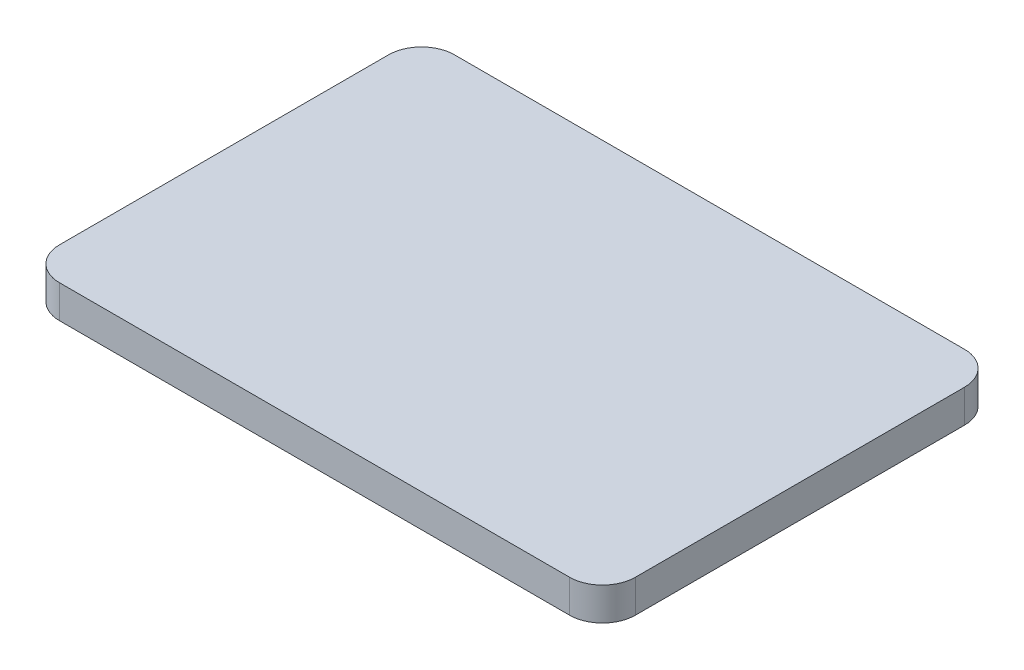
ISO-10303-21;
HEADER;
FILE_DESCRIPTION(('STEP AP214'),'2;1');
FILE_NAME('part.step','',(''),(''),'','','');
FILE_SCHEMA(('AUTOMOTIVE_DESIGN { 1 0 10303 214 1 1 1 1 }'));
ENDSEC;
DATA;
#1=APPLICATION_CONTEXT('core data for automotive mechanical design processes');
#2=APPLICATION_PROTOCOL_DEFINITION('international standard','automotive_design',2000,#1);
#3=PRODUCT_CONTEXT('',#1,'mechanical');
#4=PRODUCT('Part','Part','',(#3));
#5=PRODUCT_RELATED_PRODUCT_CATEGORY('part','',(#4));
#6=PRODUCT_DEFINITION_FORMATION('','',#4);
#7=PRODUCT_DEFINITION_CONTEXT('part definition',#1,'design');
#8=PRODUCT_DEFINITION('design','',#6,#7);
#9=PRODUCT_DEFINITION_SHAPE('','',#8);
#10=(LENGTH_UNIT() NAMED_UNIT(*) SI_UNIT(.MILLI.,.METRE.));
#11=(NAMED_UNIT(*) PLANE_ANGLE_UNIT() SI_UNIT($,.RADIAN.));
#12=(NAMED_UNIT(*) SI_UNIT($,.STERADIAN.) SOLID_ANGLE_UNIT());
#13=UNCERTAINTY_MEASURE_WITH_UNIT(LENGTH_MEASURE(1.E-05),#10,'distance_accuracy_value','');
#14=(GEOMETRIC_REPRESENTATION_CONTEXT(3) GLOBAL_UNCERTAINTY_ASSIGNED_CONTEXT((#13)) GLOBAL_UNIT_ASSIGNED_CONTEXT((#10,
#11,#12)) REPRESENTATION_CONTEXT('',''));
#15=CARTESIAN_POINT('',(0.,0.,0.));
#16=DIRECTION('',(0.,0.,1.));
#17=DIRECTION('',(1.,0.,0.));
#18=AXIS2_PLACEMENT_3D('',#15,#16,#17);
#19=CARTESIAN_POINT('',(0.999999999999997,1.,-11.));
#20=DIRECTION('',(0.,-1.,0.));
#21=DIRECTION('',(0.,0.,-1.));
#22=AXIS2_PLACEMENT_3D('',#19,#20,#21);
#23=CYLINDRICAL_SURFACE('',#22,1.);
#24=CARTESIAN_POINT('',(0.999999999999997,0.,-11.));
#25=DIRECTION('',(0.,1.,0.));
#26=DIRECTION('',(0.,0.,-1.));
#27=AXIS2_PLACEMENT_3D('',#24,#25,#26);
#28=CIRCLE('',#27,1.);
#29=CARTESIAN_POINT('',(1.,0.,-12.));
#30=VERTEX_POINT('',#29);
#31=CARTESIAN_POINT('',(0.,0.,-11.));
#32=VERTEX_POINT('',#31);
#33=EDGE_CURVE('E145',#30,#32,#28,.T.);
#34=ORIENTED_EDGE('',*,*,#33,.T.);
#35=DIRECTION('',(0.,-1.,0.));
#36=VECTOR('',#35,1.);
#37=CARTESIAN_POINT('',(0.,1.,-11.));
#38=LINE('',#37,#36);
#39=CARTESIAN_POINT('',(0.,1.,-11.));
#40=VERTEX_POINT('',#39);
#41=EDGE_CURVE('E11',#40,#32,#38,.T.);
#42=ORIENTED_EDGE('',*,*,#41,.F.);
#43=CARTESIAN_POINT('',(0.999999999999997,1.,-11.));
#44=DIRECTION('',(0.,1.,0.));
#45=DIRECTION('',(0.,0.,-1.));
#46=AXIS2_PLACEMENT_3D('',#43,#44,#45);
#47=CIRCLE('',#46,1.);
#48=CARTESIAN_POINT('',(1.,1.,-12.));
#49=VERTEX_POINT('',#48);
#50=EDGE_CURVE('E167',#49,#40,#47,.T.);
#51=ORIENTED_EDGE('',*,*,#50,.F.);
#52=DIRECTION('',(0.,-1.,0.));
#53=VECTOR('',#52,1.);
#54=CARTESIAN_POINT('',(1.,1.,-12.));
#55=LINE('',#54,#53);
#56=EDGE_CURVE('E141',#49,#30,#55,.T.);
#57=ORIENTED_EDGE('',*,*,#56,.T.);
#58=EDGE_LOOP('',(#34,#42,#51,#57));
#59=FACE_BOUND('',#58,.T.);
#60=ADVANCED_FACE('F44',(#59),#23,.T.);
#61=CARTESIAN_POINT('',(0.,1.,-1.00000000000001));
#62=DIRECTION('',(1.,0.,0.));
#63=DIRECTION('',(0.,0.,-1.));
#64=AXIS2_PLACEMENT_3D('',#61,#62,#63);
#65=PLANE('',#64);
#66=DIRECTION('',(0.,0.,1.));
#67=VECTOR('',#66,1.);
#68=CARTESIAN_POINT('',(0.,0.,-1.00000000000001));
#69=LINE('',#68,#67);
#70=CARTESIAN_POINT('',(0.,0.,-1.00000000000001));
#71=VERTEX_POINT('',#70);
#72=EDGE_CURVE('E149',#32,#71,#69,.T.);
#73=ORIENTED_EDGE('',*,*,#72,.T.);
#74=DIRECTION('',(0.,-1.,0.));
#75=VECTOR('',#74,1.);
#76=CARTESIAN_POINT('',(0.,1.,-1.00000000000001));
#77=LINE('',#76,#75);
#78=CARTESIAN_POINT('',(0.,1.,-1.00000000000001));
#79=VERTEX_POINT('',#78);
#80=EDGE_CURVE('E53',#79,#71,#77,.T.);
#81=ORIENTED_EDGE('',*,*,#80,.F.);
#82=DIRECTION('',(0.,0.,1.));
#83=VECTOR('',#82,1.);
#84=CARTESIAN_POINT('',(0.,1.,-1.00000000000001));
#85=LINE('',#84,#83);
#86=EDGE_CURVE('E104',#40,#79,#85,.T.);
#87=ORIENTED_EDGE('',*,*,#86,.F.);
#88=ORIENTED_EDGE('',*,*,#41,.T.);
#89=EDGE_LOOP('',(#73,#81,#87,#88));
#90=FACE_BOUND('',#89,.T.);
#91=ADVANCED_FACE('F213',(#90),#65,.F.);
#92=CARTESIAN_POINT('',(1.,1.,-1.));
#93=DIRECTION('',(0.,-1.,0.));
#94=DIRECTION('',(0.,0.,-1.));
#95=AXIS2_PLACEMENT_3D('',#92,#93,#94);
#96=CYLINDRICAL_SURFACE('',#95,1.);
#97=CARTESIAN_POINT('',(1.,0.,-1.));
#98=DIRECTION('',(0.,1.,0.));
#99=DIRECTION('',(0.,0.,1.));
#100=AXIS2_PLACEMENT_3D('',#97,#98,#99);
#101=CIRCLE('',#100,1.);
#102=CARTESIAN_POINT('',(1.,0.,0.));
#103=VERTEX_POINT('',#102);
#104=EDGE_CURVE('E152',#71,#103,#101,.T.);
#105=ORIENTED_EDGE('',*,*,#104,.T.);
#106=DIRECTION('',(0.,-1.,0.));
#107=VECTOR('',#106,1.);
#108=CARTESIAN_POINT('',(1.,1.,0.));
#109=LINE('',#108,#107);
#110=CARTESIAN_POINT('',(1.,1.,0.));
#111=VERTEX_POINT('',#110);
#112=EDGE_CURVE('E178',#111,#103,#109,.T.);
#113=ORIENTED_EDGE('',*,*,#112,.F.);
#114=CARTESIAN_POINT('',(1.,1.,-1.));
#115=DIRECTION('',(0.,1.,0.));
#116=DIRECTION('',(0.,0.,1.));
#117=AXIS2_PLACEMENT_3D('',#114,#115,#116);
#118=CIRCLE('',#117,1.);
#119=EDGE_CURVE('E188',#79,#111,#118,.T.);
#120=ORIENTED_EDGE('',*,*,#119,.F.);
#121=ORIENTED_EDGE('',*,*,#80,.T.);
#122=EDGE_LOOP('',(#105,#113,#120,#121));
#123=FACE_BOUND('',#122,.T.);
#124=ADVANCED_FACE('F186',(#123),#96,.T.);
#125=CARTESIAN_POINT('',(16.5,1.,0.));
#126=DIRECTION('',(0.,0.,-1.));
#127=DIRECTION('',(-1.,0.,0.));
#128=AXIS2_PLACEMENT_3D('',#125,#126,#127);
#129=PLANE('',#128);
#130=DIRECTION('',(1.,0.,0.));
#131=VECTOR('',#130,1.);
#132=CARTESIAN_POINT('',(16.5,0.,0.));
#133=LINE('',#132,#131);
#134=CARTESIAN_POINT('',(16.5,0.,0.));
#135=VERTEX_POINT('',#134);
#136=EDGE_CURVE('E155',#103,#135,#133,.T.);
#137=ORIENTED_EDGE('',*,*,#136,.T.);
#138=DIRECTION('',(0.,-1.,0.));
#139=VECTOR('',#138,1.);
#140=CARTESIAN_POINT('',(16.5,1.,0.));
#141=LINE('',#140,#139);
#142=CARTESIAN_POINT('',(16.5,1.,0.));
#143=VERTEX_POINT('',#142);
#144=EDGE_CURVE('E174',#143,#135,#141,.T.);
#145=ORIENTED_EDGE('',*,*,#144,.F.);
#146=DIRECTION('',(1.,0.,0.));
#147=VECTOR('',#146,1.);
#148=CARTESIAN_POINT('',(16.5,1.,0.));
#149=LINE('',#148,#147);
#150=EDGE_CURVE('E201',#111,#143,#149,.T.);
#151=ORIENTED_EDGE('',*,*,#150,.F.);
#152=ORIENTED_EDGE('',*,*,#112,.T.);
#153=EDGE_LOOP('',(#137,#145,#151,#152));
#154=FACE_BOUND('',#153,.T.);
#155=ADVANCED_FACE('F196',(#154),#129,.F.);
#156=CARTESIAN_POINT('',(16.5,1.,-1.));
#157=DIRECTION('',(0.,-1.,0.));
#158=DIRECTION('',(0.,0.,-1.));
#159=AXIS2_PLACEMENT_3D('',#156,#157,#158);
#160=CYLINDRICAL_SURFACE('',#159,1.);
#161=CARTESIAN_POINT('',(16.5,0.,-1.));
#162=DIRECTION('',(0.,1.,0.));
#163=DIRECTION('',(0.,0.,-1.));
#164=AXIS2_PLACEMENT_3D('',#161,#162,#163);
#165=CIRCLE('',#164,1.);
#166=CARTESIAN_POINT('',(17.5,0.,-1.00000000000001));
#167=VERTEX_POINT('',#166);
#168=EDGE_CURVE('E158',#135,#167,#165,.T.);
#169=ORIENTED_EDGE('',*,*,#168,.T.);
#170=DIRECTION('',(0.,-1.,0.));
#171=VECTOR('',#170,1.);
#172=CARTESIAN_POINT('',(17.5,1.,-1.00000000000001));
#173=LINE('',#172,#171);
#174=CARTESIAN_POINT('',(17.5,1.,-1.00000000000001));
#175=VERTEX_POINT('',#174);
#176=EDGE_CURVE('E134',#175,#167,#173,.T.);
#177=ORIENTED_EDGE('',*,*,#176,.F.);
#178=CARTESIAN_POINT('',(16.5,1.,-1.));
#179=DIRECTION('',(0.,1.,0.));
#180=DIRECTION('',(0.,0.,-1.));
#181=AXIS2_PLACEMENT_3D('',#178,#179,#180);
#182=CIRCLE('',#181,1.);
#183=EDGE_CURVE('E123',#143,#175,#182,.T.);
#184=ORIENTED_EDGE('',*,*,#183,.F.);
#185=ORIENTED_EDGE('',*,*,#144,.T.);
#186=EDGE_LOOP('',(#169,#177,#184,#185));
#187=FACE_BOUND('',#186,.T.);
#188=ADVANCED_FACE('F199',(#187),#160,.T.);
#189=CARTESIAN_POINT('',(17.5,1.,-11.));
#190=DIRECTION('',(-1.,0.,0.));
#191=DIRECTION('',(0.,0.,1.));
#192=AXIS2_PLACEMENT_3D('',#189,#190,#191);
#193=PLANE('',#192);
#194=DIRECTION('',(0.,0.,-1.));
#195=VECTOR('',#194,1.);
#196=CARTESIAN_POINT('',(17.5,0.,-11.));
#197=LINE('',#196,#195);
#198=CARTESIAN_POINT('',(17.5,0.,-11.));
#199=VERTEX_POINT('',#198);
#200=EDGE_CURVE('E132',#167,#199,#197,.T.);
#201=ORIENTED_EDGE('',*,*,#200,.T.);
#202=DIRECTION('',(0.,-1.,0.));
#203=VECTOR('',#202,1.);
#204=CARTESIAN_POINT('',(17.5,1.,-11.));
#205=LINE('',#204,#203);
#206=CARTESIAN_POINT('',(17.5,1.,-11.));
#207=VERTEX_POINT('',#206);
#208=EDGE_CURVE('E129',#207,#199,#205,.T.);
#209=ORIENTED_EDGE('',*,*,#208,.F.);
#210=DIRECTION('',(0.,0.,-1.));
#211=VECTOR('',#210,1.);
#212=CARTESIAN_POINT('',(17.5,1.,-11.));
#213=LINE('',#212,#211);
#214=EDGE_CURVE('E117',#175,#207,#213,.T.);
#215=ORIENTED_EDGE('',*,*,#214,.F.);
#216=ORIENTED_EDGE('',*,*,#176,.T.);
#217=EDGE_LOOP('',(#201,#209,#215,#216));
#218=FACE_BOUND('',#217,.T.);
#219=ADVANCED_FACE('F130',(#218),#193,.F.);
#220=CARTESIAN_POINT('',(16.5,1.,-11.));
#221=DIRECTION('',(0.,-1.,0.));
#222=DIRECTION('',(0.,0.,-1.));
#223=AXIS2_PLACEMENT_3D('',#220,#221,#222);
#224=CYLINDRICAL_SURFACE('',#223,1.);
#225=CARTESIAN_POINT('',(16.5,0.,-11.));
#226=DIRECTION('',(0.,1.,0.));
#227=DIRECTION('',(0.,0.,-1.));
#228=AXIS2_PLACEMENT_3D('',#225,#226,#227);
#229=CIRCLE('',#228,1.);
#230=CARTESIAN_POINT('',(16.5,0.,-12.));
#231=VERTEX_POINT('',#230);
#232=EDGE_CURVE('E90',#199,#231,#229,.T.);
#233=ORIENTED_EDGE('',*,*,#232,.T.);
#234=DIRECTION('',(0.,-1.,0.));
#235=VECTOR('',#234,1.);
#236=CARTESIAN_POINT('',(16.5,1.,-12.));
#237=LINE('',#236,#235);
#238=CARTESIAN_POINT('',(16.5,1.,-12.));
#239=VERTEX_POINT('',#238);
#240=EDGE_CURVE('E135',#239,#231,#237,.T.);
#241=ORIENTED_EDGE('',*,*,#240,.F.);
#242=CARTESIAN_POINT('',(16.5,1.,-11.));
#243=DIRECTION('',(0.,1.,0.));
#244=DIRECTION('',(0.,0.,-1.));
#245=AXIS2_PLACEMENT_3D('',#242,#243,#244);
#246=CIRCLE('',#245,1.);
#247=EDGE_CURVE('E121',#207,#239,#246,.T.);
#248=ORIENTED_EDGE('',*,*,#247,.F.);
#249=ORIENTED_EDGE('',*,*,#208,.T.);
#250=EDGE_LOOP('',(#233,#241,#248,#249));
#251=FACE_BOUND('',#250,.T.);
#252=ADVANCED_FACE('F137',(#251),#224,.T.);
#253=CARTESIAN_POINT('',(1.,1.,-12.));
#254=DIRECTION('',(0.,0.,1.));
#255=DIRECTION('',(1.,0.,0.));
#256=AXIS2_PLACEMENT_3D('',#253,#254,#255);
#257=PLANE('',#256);
#258=DIRECTION('',(-1.,0.,0.));
#259=VECTOR('',#258,1.);
#260=CARTESIAN_POINT('',(1.,0.,-12.));
#261=LINE('',#260,#259);
#262=EDGE_CURVE('E96',#231,#30,#261,.T.);
#263=ORIENTED_EDGE('',*,*,#262,.T.);
#264=ORIENTED_EDGE('',*,*,#56,.F.);
#265=DIRECTION('',(-1.,0.,0.));
#266=VECTOR('',#265,1.);
#267=CARTESIAN_POINT('',(1.,1.,-12.));
#268=LINE('',#267,#266);
#269=EDGE_CURVE('E61',#239,#49,#268,.T.);
#270=ORIENTED_EDGE('',*,*,#269,.F.);
#271=ORIENTED_EDGE('',*,*,#240,.T.);
#272=EDGE_LOOP('',(#263,#264,#270,#271));
#273=FACE_BOUND('',#272,.T.);
#274=ADVANCED_FACE('F229',(#273),#257,.F.);
#275=CARTESIAN_POINT('',(0.999999999999997,1.,-11.));
#276=DIRECTION('',(0.,-1.,0.));
#277=DIRECTION('',(0.,0.,-1.));
#278=AXIS2_PLACEMENT_3D('',#275,#276,#277);
#279=PLANE('',#278);
#280=ORIENTED_EDGE('',*,*,#50,.T.);
#281=ORIENTED_EDGE('',*,*,#86,.T.);
#282=ORIENTED_EDGE('',*,*,#119,.T.);
#283=ORIENTED_EDGE('',*,*,#150,.T.);
#284=ORIENTED_EDGE('',*,*,#183,.T.);
#285=ORIENTED_EDGE('',*,*,#214,.T.);
#286=ORIENTED_EDGE('',*,*,#247,.T.);
#287=ORIENTED_EDGE('',*,*,#269,.T.);
#288=EDGE_LOOP('',(#280,#281,#282,#283,#284,#285,#286,#287));
#289=FACE_BOUND('',#288,.T.);
#290=ADVANCED_FACE('F119',(#289),#279,.F.);
#291=CARTESIAN_POINT('',(0.999999999999997,0.,-11.));
#292=DIRECTION('',(0.,-1.,0.));
#293=DIRECTION('',(0.,0.,-1.));
#294=AXIS2_PLACEMENT_3D('',#291,#292,#293);
#295=PLANE('',#294);
#296=ORIENTED_EDGE('',*,*,#33,.F.);
#297=ORIENTED_EDGE('',*,*,#262,.F.);
#298=ORIENTED_EDGE('',*,*,#232,.F.);
#299=ORIENTED_EDGE('',*,*,#200,.F.);
#300=ORIENTED_EDGE('',*,*,#168,.F.);
#301=ORIENTED_EDGE('',*,*,#136,.F.);
#302=ORIENTED_EDGE('',*,*,#104,.F.);
#303=ORIENTED_EDGE('',*,*,#72,.F.);
#304=EDGE_LOOP('',(#296,#297,#298,#299,#300,#301,#302,#303));
#305=FACE_BOUND('',#304,.T.);
#306=ADVANCED_FACE('F192',(#305),#295,.T.);
#307=CLOSED_SHELL('',(#60,#91,#124,#155,#188,#219,#252,#274,#290,#306));
#308=MANIFOLD_SOLID_BREP('B2',#307);
#309=ADVANCED_BREP_SHAPE_REPRESENTATION('',(#18,#308),#14);
#310=SHAPE_DEFINITION_REPRESENTATION(#9,#309);
ENDSEC;
END-ISO-10303-21;
